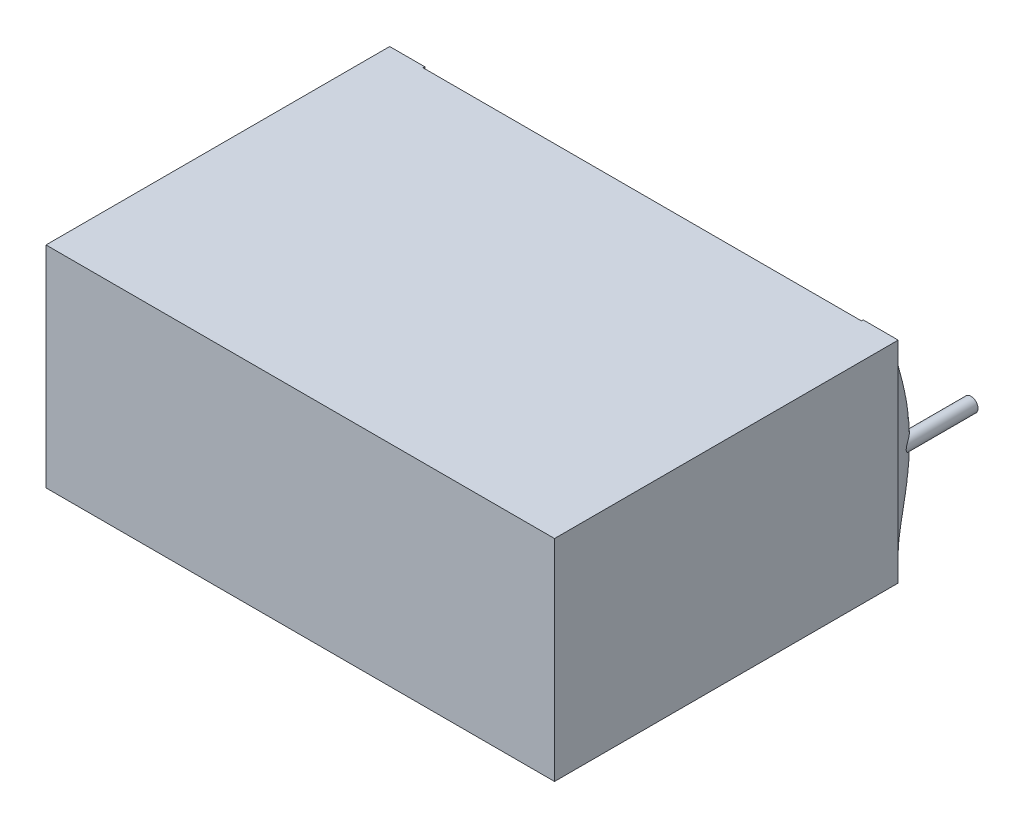
ISO-10303-21;
HEADER;
FILE_DESCRIPTION(('STEP AP214'),'2;1');
FILE_NAME('part.step','',(''),(''),'','','');
FILE_SCHEMA(('AUTOMOTIVE_DESIGN { 1 0 10303 214 1 1 1 1 }'));
ENDSEC;
DATA;
#1=APPLICATION_CONTEXT('core data for automotive mechanical design processes');
#2=APPLICATION_PROTOCOL_DEFINITION('international standard','automotive_design',2000,#1);
#3=PRODUCT_CONTEXT('',#1,'mechanical');
#4=PRODUCT('Part','Part','',(#3));
#5=PRODUCT_RELATED_PRODUCT_CATEGORY('part','',(#4));
#6=PRODUCT_DEFINITION_FORMATION('','',#4);
#7=PRODUCT_DEFINITION_CONTEXT('part definition',#1,'design');
#8=PRODUCT_DEFINITION('design','',#6,#7);
#9=PRODUCT_DEFINITION_SHAPE('','',#8);
#10=(LENGTH_UNIT() NAMED_UNIT(*) SI_UNIT(.MILLI.,.METRE.));
#11=(NAMED_UNIT(*) PLANE_ANGLE_UNIT() SI_UNIT($,.RADIAN.));
#12=(NAMED_UNIT(*) SI_UNIT($,.STERADIAN.) SOLID_ANGLE_UNIT());
#13=UNCERTAINTY_MEASURE_WITH_UNIT(LENGTH_MEASURE(1.E-05),#10,'distance_accuracy_value','');
#14=(GEOMETRIC_REPRESENTATION_CONTEXT(3) GLOBAL_UNCERTAINTY_ASSIGNED_CONTEXT((#13)) GLOBAL_UNIT_ASSIGNED_CONTEXT((#10,
#11,#12)) REPRESENTATION_CONTEXT('',''));
#15=CARTESIAN_POINT('',(0.,0.,0.));
#16=DIRECTION('',(0.,0.,1.));
#17=DIRECTION('',(1.,0.,0.));
#18=AXIS2_PLACEMENT_3D('',#15,#16,#17);
#19=CARTESIAN_POINT('',(36.8674969975976,-6.,2.));
#20=DIRECTION('',(0.,0.,1.));
#21=DIRECTION('',(1.,0.,0.));
#22=AXIS2_PLACEMENT_3D('',#19,#20,#21);
#23=PLANE('',#22);
#24=DIRECTION('',(0.,-1.,0.));
#25=VECTOR('',#24,1.);
#26=CARTESIAN_POINT('',(9.8674969975976,-6.,2.));
#27=LINE('',#26,#25);
#28=CARTESIAN_POINT('',(9.8674969975976,6.,2.));
#29=VERTEX_POINT('',#28);
#30=CARTESIAN_POINT('',(9.8674969975976,-6.,2.));
#31=VERTEX_POINT('',#30);
#32=EDGE_CURVE('E432',#29,#31,#27,.T.);
#33=ORIENTED_EDGE('',*,*,#32,.F.);
#34=DIRECTION('',(-1.,0.,0.));
#35=VECTOR('',#34,1.);
#36=CARTESIAN_POINT('',(7.8674969975976,6.,2.));
#37=LINE('',#36,#35);
#38=CARTESIAN_POINT('',(34.8674969975976,6.,2.));
#39=VERTEX_POINT('',#38);
#40=EDGE_CURVE('E290',#39,#29,#37,.T.);
#41=ORIENTED_EDGE('',*,*,#40,.F.);
#42=DIRECTION('',(0.,1.,0.));
#43=VECTOR('',#42,1.);
#44=CARTESIAN_POINT('',(34.8674969975976,6.,2.));
#45=LINE('',#44,#43);
#46=CARTESIAN_POINT('',(34.8674969975976,-6.,2.));
#47=VERTEX_POINT('',#46);
#48=EDGE_CURVE('E351',#47,#39,#45,.T.);
#49=ORIENTED_EDGE('',*,*,#48,.F.);
#50=DIRECTION('',(1.,0.,0.));
#51=VECTOR('',#50,1.);
#52=CARTESIAN_POINT('',(36.8674969975976,-6.,2.));
#53=LINE('',#52,#51);
#54=EDGE_CURVE('E246',#31,#47,#53,.T.);
#55=ORIENTED_EDGE('',*,*,#54,.F.);
#56=EDGE_LOOP('',(#33,#41,#49,#55));
#57=FACE_BOUND('',#56,.T.);
#58=ADVANCED_FACE('F223',(#57),#23,.F.);
#59=CARTESIAN_POINT('',(36.8674969975976,-6.,21.5));
#60=DIRECTION('',(0.,1.,0.));
#61=DIRECTION('',(-1.,0.,0.));
#62=AXIS2_PLACEMENT_3D('',#59,#60,#61);
#63=PLANE('',#62);
#64=DIRECTION('',(0.,0.,-1.));
#65=VECTOR('',#64,1.);
#66=CARTESIAN_POINT('',(7.8674969975976,-6.,21.5));
#67=LINE('',#66,#65);
#68=CARTESIAN_POINT('',(7.8674969975976,-6.,21.5));
#69=VERTEX_POINT('',#68);
#70=CARTESIAN_POINT('',(7.86749699759759,-6.,1.90018719506918));
#71=VERTEX_POINT('',#70);
#72=EDGE_CURVE('E322',#69,#71,#67,.T.);
#73=ORIENTED_EDGE('',*,*,#72,.T.);
#74=CARTESIAN_POINT('',(9.86749699759759,-5.99999999999999,1.90018812940335));
#75=CARTESIAN_POINT('',(9.79835259962124,-6.,1.89989284296278));
#76=CARTESIAN_POINT('',(9.72920793500892,-6.,1.89972873036072));
#77=CARTESIAN_POINT('',(9.59091853304827,-6.,1.89956002418815));
#78=CARTESIAN_POINT('',(9.52177379570048,-6.,1.89955543024527));
#79=CARTESIAN_POINT('',(9.31433957411765,-6.,1.89962668340483));
#80=CARTESIAN_POINT('',(9.17605018735916,-6.00000000000001,1.8997875656342));
#81=CARTESIAN_POINT('',(8.94023870868776,-6.00000000000001,1.89991081176893));
#82=CARTESIAN_POINT('',(8.84271665765362,-6.,1.8999177168697));
#83=CARTESIAN_POINT('',(8.64767264918446,-6.,1.89984419422075));
#84=CARTESIAN_POINT('',(8.55015069174942,-6.,1.89976376648727));
#85=CARTESIAN_POINT('',(8.35510665607188,-6.,1.89960815940389));
#86=CARTESIAN_POINT('',(8.25758457782935,-6.,1.8995329800555));
#87=CARTESIAN_POINT('',(8.06254058180711,-6.,1.8996220103945));
#88=CARTESIAN_POINT('',(7.9650186640275,-6.,1.89978622019137));
#89=CARTESIAN_POINT('',(7.86749699759757,-6.,1.90018719506919));
#90=B_SPLINE_CURVE_WITH_KNOTS('',3,(#74,#75,#76,#77,#78,#79,#80,#81,#82,#83,#84,#85,#86,#87,#88,
#89),.UNSPECIFIED.,.F.,.F.,(4,2,2,2,2,2,2,4),(0.,0.207434556948013,0.414868629673564,
0.829737096172103,1.1223031718588,1.414869193166,1.7074352991832,2.00000153900381),.UNSPECIFIED.);
#91=CARTESIAN_POINT('',(9.86749699759759,-5.99999999999999,1.90018812940335));
#92=VERTEX_POINT('',#91);
#93=EDGE_CURVE('E283',#92,#71,#90,.T.);
#94=ORIENTED_EDGE('',*,*,#93,.F.);
#95=DIRECTION('',(0.,0.,1.));
#96=VECTOR('',#95,1.);
#97=CARTESIAN_POINT('',(9.8674969975976,-6.,1.9));
#98=LINE('',#97,#96);
#99=EDGE_CURVE('E277',#92,#31,#98,.T.);
#100=ORIENTED_EDGE('',*,*,#99,.T.);
#101=ORIENTED_EDGE('',*,*,#54,.T.);
#102=DIRECTION('',(0.,0.,1.));
#103=VECTOR('',#102,1.);
#104=CARTESIAN_POINT('',(34.8674969975976,-6.,1.9));
#105=LINE('',#104,#103);
#106=CARTESIAN_POINT('',(34.8674969975976,-6.,1.90018153614774));
#107=VERTEX_POINT('',#106);
#108=EDGE_CURVE('E337',#107,#47,#105,.T.);
#109=ORIENTED_EDGE('',*,*,#108,.F.);
#110=CARTESIAN_POINT('',(36.8674969975976,-6.00000000000001,1.90018724188292));
#111=CARTESIAN_POINT('',(36.798352598685,-6.,1.89989203534321));
#112=CARTESIAN_POINT('',(36.7292079336438,-6.,1.89972817813167));
#113=CARTESIAN_POINT('',(36.5909185307416,-6.,1.89956000573595));
#114=CARTESIAN_POINT('',(36.5217737928812,-6.,1.89955569018059));
#115=CARTESIAN_POINT('',(36.3143395708487,-6.,1.89962732102807));
#116=CARTESIAN_POINT('',(36.176050183999,-6.00000000000001,1.89978784508049));
#117=CARTESIAN_POINT('',(35.9402387064645,-6.00000000000001,1.89991050790632));
#118=CARTESIAN_POINT('',(35.8427166565192,-6.,1.89991717978203));
#119=CARTESIAN_POINT('',(35.6476726492115,-6.,1.89984372846159));
#120=CARTESIAN_POINT('',(35.5501506918491,-6.,1.89976360528126));
#121=CARTESIAN_POINT('',(35.3551066588487,-6.,1.89960890878508));
#122=CARTESIAN_POINT('',(35.2575845832106,-6.,1.89953433547078));
#123=CARTESIAN_POINT('',(35.062540588838,-6.,1.89962225594804));
#124=CARTESIAN_POINT('',(34.9650186701036,-5.99999999999999,1.89978474984599));
#125=CARTESIAN_POINT('',(34.8674969975976,-6.,1.90018153614774));
#126=B_SPLINE_CURVE_WITH_KNOTS('',3,(#110,#111,#112,#113,#114,#115,#116,#117,#118,#119,#120,
#121,#122,#123,#124,#125),.UNSPECIFIED.,.F.,.F.,(4,2,2,2,2,2,2,4),(0.,0.207434556936427,
0.414868631269337,0.829737097255718,1.12230317012146,1.41486918962224,1.7074352905595,
2.00000152277545),.UNSPECIFIED.);
#127=CARTESIAN_POINT('',(36.8674969975976,-5.99999999999999,1.90018724188292));
#128=VERTEX_POINT('',#127);
#129=EDGE_CURVE('E350',#128,#107,#126,.T.);
#130=ORIENTED_EDGE('',*,*,#129,.F.);
#131=DIRECTION('',(0.,0.,-1.));
#132=VECTOR('',#131,1.);
#133=CARTESIAN_POINT('',(36.8674969975976,-6.,21.5));
#134=LINE('',#133,#132);
#135=CARTESIAN_POINT('',(36.8674969975976,-6.,21.5));
#136=VERTEX_POINT('',#135);
#137=EDGE_CURVE('E341',#136,#128,#134,.T.);
#138=ORIENTED_EDGE('',*,*,#137,.F.);
#139=DIRECTION('',(1.,0.,0.));
#140=VECTOR('',#139,1.);
#141=CARTESIAN_POINT('',(36.8674969975976,-6.,21.5));
#142=LINE('',#141,#140);
#143=EDGE_CURVE('E439',#69,#136,#142,.T.);
#144=ORIENTED_EDGE('',*,*,#143,.F.);
#145=EDGE_LOOP('',(#73,#94,#100,#101,#109,#130,#138,#144));
#146=FACE_BOUND('',#145,.T.);
#147=ADVANCED_FACE('F367',(#146),#63,.F.);
#148=CARTESIAN_POINT('',(36.8674969975976,6.,21.5));
#149=DIRECTION('',(-1.,0.,0.));
#150=DIRECTION('',(0.,0.,1.));
#151=AXIS2_PLACEMENT_3D('',#148,#149,#150);
#152=PLANE('',#151);
#153=ORIENTED_EDGE('',*,*,#137,.T.);
#154=CARTESIAN_POINT('',(36.8674969975976,5.99999999999999,1.90018719506919));
#155=CARTESIAN_POINT('',(36.8674969975977,5.86171168250951,1.90014004041916));
#156=CARTESIAN_POINT('',(36.8674969975976,5.72342336298642,1.90009932998568));
#157=CARTESIAN_POINT('',(36.8674969975976,5.44684672114222,1.90002896482786));
#158=CARTESIAN_POINT('',(36.8674969975975,5.3085583988211,1.89999931010352));
#159=CARTESIAN_POINT('',(36.8674969975975,5.03198175260018,1.89994922364002));
#160=CARTESIAN_POINT('',(36.8674969975976,4.89369342870038,1.89992879190086));
#161=CARTESIAN_POINT('',(36.8674969975977,4.47882845548978,1.89987879635969));
#162=CARTESIAN_POINT('',(36.8674969975975,4.20225180484181,1.89986053223399));
#163=CARTESIAN_POINT('',(36.8674969975975,3.64909850348765,1.89984237431071));
#164=CARTESIAN_POINT('',(36.8674969975975,3.37252185278144,1.8998424805131));
#165=CARTESIAN_POINT('',(36.8674969975976,2.95765687692437,1.89984938585406));
#166=CARTESIAN_POINT('',(36.8674969975976,2.81936855169693,1.89985281197394));
#167=CARTESIAN_POINT('',(36.8674969975976,2.4045035760859,1.89986505783325));
#168=CARTESIAN_POINT('',(36.8674969975976,2.12792692577084,1.89987584507232));
#169=CARTESIAN_POINT('',(36.8674969975976,1.29819697464354,1.89990608819711));
#170=CARTESIAN_POINT('',(36.8674969975976,0.74504367368343,1.89992342549037));
#171=CARTESIAN_POINT('',(36.8674969975976,-0.361262928550195,1.89992934925927));
#172=CARTESIAN_POINT('',(36.8674969975976,-0.914416229823708,1.89991793573491));
#173=CARTESIAN_POINT('',(36.8674969975976,-1.60585785591304,1.899894944135));
#174=CARTESIAN_POINT('',(36.8674969975976,-1.74414618108196,1.89988990958029));
#175=CARTESIAN_POINT('',(36.8674969975976,-2.1590111565852,1.89987454095472));
#176=CARTESIAN_POINT('',(36.8674969975976,-2.4355878069159,1.8998639419224));
#177=CARTESIAN_POINT('',(36.8674969975976,-2.98874110777997,1.8998480392004));
#178=CARTESIAN_POINT('',(36.8674969975976,-3.26531775831334,1.89984273551073));
#179=CARTESIAN_POINT('',(36.8674969975976,-3.81847105963628,1.89984587573069));
#180=CARTESIAN_POINT('',(36.8674969975976,-4.09504771042584,1.89985431964033));
#181=CARTESIAN_POINT('',(36.8674969975976,-4.50991268527252,1.8998853174187));
#182=CARTESIAN_POINT('',(36.8674969975977,-4.64820100998463,1.89989870533047));
#183=CARTESIAN_POINT('',(36.8674969975977,-4.92477765849985,1.89993316500749));
#184=CARTESIAN_POINT('',(36.8674969975976,-5.06306598230296,1.89995423677274));
#185=CARTESIAN_POINT('',(36.8674969975976,-5.33446192297882,1.90000476548834));
#186=CARTESIAN_POINT('',(36.8674969975976,-5.46756953991362,1.90003387873007));
#187=CARTESIAN_POINT('',(36.8674969975976,-5.73378477186355,1.90010241554949));
#188=CARTESIAN_POINT('',(36.8674969975976,-5.86689238687869,1.90014183912723));
#189=CARTESIAN_POINT('',(36.8674969975976,-6.,1.90018724188292));
#190=B_SPLINE_CURVE_WITH_KNOTS('',3,(#154,#155,#156,#157,#158,#159,#160,#161,#162,#163,#164,
#165,#166,#167,#168,#169,#170,#171,#172,#173,#174,#175,#176,#177,#178,#179,#180,#181,#182,#183,
#184,#185,#186,#187,#188,#189),.UNSPECIFIED.,.F.,.F.,(4,2,2,2,2,2,2,2,2,2,2,2,2,2,2,2,2,4),(0.,
0.414864976203014,0.829729952288654,1.24459492828302,2.0743248807939,2.90405483269042,
3.31891980849137,4.14864976008514,5.80810966337549,7.46756956692262,7.88243454271412,
8.71216449429745,9.54189444596856,10.3716243979557,10.7864893738662,11.2013543498408,
11.6006772098218,12.0000000720707),.UNSPECIFIED.);
#191=CARTESIAN_POINT('',(36.8674969975976,6.,1.90018719506919));
#192=VERTEX_POINT('',#191);
#193=EDGE_CURVE('E343',#192,#128,#190,.T.);
#194=ORIENTED_EDGE('',*,*,#193,.F.);
#195=DIRECTION('',(0.,0.,-1.));
#196=VECTOR('',#195,1.);
#197=CARTESIAN_POINT('',(36.8674969975976,6.,21.5));
#198=LINE('',#197,#196);
#199=CARTESIAN_POINT('',(36.8674969975976,6.,21.5));
#200=VERTEX_POINT('',#199);
#201=EDGE_CURVE('E321',#200,#192,#198,.T.);
#202=ORIENTED_EDGE('',*,*,#201,.F.);
#203=DIRECTION('',(0.,1.,0.));
#204=VECTOR('',#203,1.);
#205=CARTESIAN_POINT('',(36.8674969975976,6.,21.5));
#206=LINE('',#205,#204);
#207=EDGE_CURVE('E309',#136,#200,#206,.T.);
#208=ORIENTED_EDGE('',*,*,#207,.F.);
#209=EDGE_LOOP('',(#153,#194,#202,#208));
#210=FACE_BOUND('',#209,.T.);
#211=ADVANCED_FACE('F357',(#210),#152,.F.);
#212=CARTESIAN_POINT('',(7.8674969975976,6.,21.5));
#213=DIRECTION('',(0.,-1.,0.));
#214=DIRECTION('',(1.,0.,0.));
#215=AXIS2_PLACEMENT_3D('',#212,#213,#214);
#216=PLANE('',#215);
#217=ORIENTED_EDGE('',*,*,#201,.T.);
#218=CARTESIAN_POINT('',(34.8674969975976,6.,1.90018812940335));
#219=CARTESIAN_POINT('',(34.936641395574,6.,1.89989284296278));
#220=CARTESIAN_POINT('',(35.0057860601863,6.,1.89972873036072));
#221=CARTESIAN_POINT('',(35.1440754621469,6.,1.89956002418815));
#222=CARTESIAN_POINT('',(35.2132201994947,6.,1.89955543024527));
#223=CARTESIAN_POINT('',(35.4206544210775,6.,1.89962668340483));
#224=CARTESIAN_POINT('',(35.558943807836,6.,1.8997875656342));
#225=CARTESIAN_POINT('',(35.7947552865074,6.,1.89991081176893));
#226=CARTESIAN_POINT('',(35.8922773375415,6.,1.8999177168697));
#227=CARTESIAN_POINT('',(36.0873213460106,6.,1.89984419422076));
#228=CARTESIAN_POINT('',(36.1848433034457,6.,1.89976376648727));
#229=CARTESIAN_POINT('',(36.3798873391232,6.,1.89960815940389));
#230=CARTESIAN_POINT('',(36.4774094173658,6.,1.8995329800555));
#231=CARTESIAN_POINT('',(36.672453413388,6.,1.8996220103945));
#232=CARTESIAN_POINT('',(36.7699753311676,6.,1.89978622019137));
#233=CARTESIAN_POINT('',(36.8674969975975,6.,1.90018719506919));
#234=B_SPLINE_CURVE_WITH_KNOTS('',3,(#218,#219,#220,#221,#222,#223,#224,#225,#226,#227,#228,
#229,#230,#231,#232,#233),.UNSPECIFIED.,.F.,.F.,(4,2,2,2,2,2,2,4),(0.,0.207434556947992,
0.414868629673516,0.829737096172013,1.1223031718587,1.4148691931659,1.70743529918309,
2.0000015390037),.UNSPECIFIED.);
#235=CARTESIAN_POINT('',(34.8674969975976,6.,1.90018812940335));
#236=VERTEX_POINT('',#235);
#237=EDGE_CURVE('E384',#236,#192,#234,.T.);
#238=ORIENTED_EDGE('',*,*,#237,.F.);
#239=DIRECTION('',(0.,0.,1.));
#240=VECTOR('',#239,1.);
#241=CARTESIAN_POINT('',(34.8674969975976,6.,1.9));
#242=LINE('',#241,#240);
#243=EDGE_CURVE('E388',#236,#39,#242,.T.);
#244=ORIENTED_EDGE('',*,*,#243,.T.);
#245=ORIENTED_EDGE('',*,*,#40,.T.);
#246=DIRECTION('',(0.,0.,1.));
#247=VECTOR('',#246,1.);
#248=CARTESIAN_POINT('',(9.8674969975976,6.,1.9));
#249=LINE('',#248,#247);
#250=CARTESIAN_POINT('',(9.86749699759759,6.,1.90018153614774));
#251=VERTEX_POINT('',#250);
#252=EDGE_CURVE('E437',#251,#29,#249,.T.);
#253=ORIENTED_EDGE('',*,*,#252,.F.);
#254=CARTESIAN_POINT('',(7.86749699759758,6.,1.90018724188293));
#255=CARTESIAN_POINT('',(7.93664139651015,6.,1.89989203534321));
#256=CARTESIAN_POINT('',(8.00578606155138,6.,1.89972817813168));
#257=CARTESIAN_POINT('',(8.14407546445358,6.,1.89956000573595));
#258=CARTESIAN_POINT('',(8.21322020231401,6.,1.89955569018059));
#259=CARTESIAN_POINT('',(8.42065442434658,6.,1.89962732102807));
#260=CARTESIAN_POINT('',(8.55894381119626,6.,1.89978784508049));
#261=CARTESIAN_POINT('',(8.79475528873079,6.,1.89991050790632));
#262=CARTESIAN_POINT('',(8.89227733867614,6.,1.89991717978204));
#263=CARTESIAN_POINT('',(9.08732134598382,6.,1.89984372846159));
#264=CARTESIAN_POINT('',(9.18484330334616,6.,1.89976360528126));
#265=CARTESIAN_POINT('',(9.37988733634655,6.,1.89960890878508));
#266=CARTESIAN_POINT('',(9.47740941198462,6.,1.89953433547078));
#267=CARTESIAN_POINT('',(9.67245340635721,6.,1.89962225594805));
#268=CARTESIAN_POINT('',(9.76997532509165,6.,1.89978474984599));
#269=CARTESIAN_POINT('',(9.86749699759759,5.99999999999999,1.90018153614774));
#270=B_SPLINE_CURVE_WITH_KNOTS('',3,(#254,#255,#256,#257,#258,#259,#260,#261,#262,#263,#264,
#265,#266,#267,#268,#269),.UNSPECIFIED.,.F.,.F.,(4,2,2,2,2,2,2,4),(0.,0.20743455693645,
0.414868631269396,0.829737097255842,1.12230317012157,1.41486918962232,1.70743529055955,
2.00000152277546),.UNSPECIFIED.);
#271=CARTESIAN_POINT('',(7.86749699759759,6.,1.90018724188293));
#272=VERTEX_POINT('',#271);
#273=EDGE_CURVE('E318',#272,#251,#270,.T.);
#274=ORIENTED_EDGE('',*,*,#273,.F.);
#275=DIRECTION('',(0.,0.,-1.));
#276=VECTOR('',#275,1.);
#277=CARTESIAN_POINT('',(7.8674969975976,6.,21.5));
#278=LINE('',#277,#276);
#279=CARTESIAN_POINT('',(7.8674969975976,6.,21.5));
#280=VERTEX_POINT('',#279);
#281=EDGE_CURVE('E315',#280,#272,#278,.T.);
#282=ORIENTED_EDGE('',*,*,#281,.F.);
#283=DIRECTION('',(-1.,0.,0.));
#284=VECTOR('',#283,1.);
#285=CARTESIAN_POINT('',(7.8674969975976,6.,21.5));
#286=LINE('',#285,#284);
#287=EDGE_CURVE('E302',#200,#280,#286,.T.);
#288=ORIENTED_EDGE('',*,*,#287,.F.);
#289=EDGE_LOOP('',(#217,#238,#244,#245,#253,#274,#282,#288));
#290=FACE_BOUND('',#289,.T.);
#291=ADVANCED_FACE('F316',(#290),#216,.F.);
#292=CARTESIAN_POINT('',(7.8674969975976,-6.,21.5));
#293=DIRECTION('',(1.,0.,0.));
#294=DIRECTION('',(0.,1.,0.));
#295=AXIS2_PLACEMENT_3D('',#292,#293,#294);
#296=PLANE('',#295);
#297=ORIENTED_EDGE('',*,*,#281,.T.);
#298=CARTESIAN_POINT('',(7.86749699759759,-6.,1.90018719506918));
#299=CARTESIAN_POINT('',(7.86749699759761,-5.86171168250949,1.90014004041913));
#300=CARTESIAN_POINT('',(7.86749699759762,-5.72342336298639,1.90009932998565));
#301=CARTESIAN_POINT('',(7.86749699759761,-5.44684672114215,1.90002896482783));
#302=CARTESIAN_POINT('',(7.8674969975976,-5.30855839882102,1.89999931010349));
#303=CARTESIAN_POINT('',(7.86749699759759,-5.03198175260007,1.89994922363998));
#304=CARTESIAN_POINT('',(7.8674969975976,-4.89369342870025,1.8999287919008));
#305=CARTESIAN_POINT('',(7.86749699759761,-4.4788284554896,1.89987879635959));
#306=CARTESIAN_POINT('',(7.86749699759762,-4.20225180484161,1.89986053223391));
#307=CARTESIAN_POINT('',(7.8674969975976,-3.64909850348737,1.89984237431065));
#308=CARTESIAN_POINT('',(7.86749699759758,-3.37252185278113,1.89984248051307));
#309=CARTESIAN_POINT('',(7.86749699759759,-2.957656876924,1.89984938585399));
#310=CARTESIAN_POINT('',(7.8674969975976,-2.81936855169655,1.89985281197385));
#311=CARTESIAN_POINT('',(7.86749699759761,-2.40450357608547,1.89986505783311));
#312=CARTESIAN_POINT('',(7.86749699759759,-2.12792692577038,1.89987584507221));
#313=CARTESIAN_POINT('',(7.86749699759756,-1.29819697464298,1.89990608819704));
#314=CARTESIAN_POINT('',(7.86749699759759,-0.745043673682798,1.89992342549028));
#315=CARTESIAN_POINT('',(7.86749699759762,0.361262928550963,1.89992934925916));
#316=CARTESIAN_POINT('',(7.86749699759761,0.914416229824544,1.89991793573481));
#317=CARTESIAN_POINT('',(7.8674969975976,1.60585785591396,1.89989494413492));
#318=CARTESIAN_POINT('',(7.8674969975976,1.7441461810829,1.89988990958022));
#319=CARTESIAN_POINT('',(7.86749699759759,2.15901115658619,1.89987454095466));
#320=CARTESIAN_POINT('',(7.86749699759759,2.43558780691692,1.89986394192233));
#321=CARTESIAN_POINT('',(7.8674969975976,2.98874110778106,1.89984803920033));
#322=CARTESIAN_POINT('',(7.8674969975976,3.26531775831447,1.89984273551066));
#323=CARTESIAN_POINT('',(7.86749699759759,3.81847105963747,1.89984587573065));
#324=CARTESIAN_POINT('',(7.86749699759758,4.09504771042707,1.89985431964031));
#325=CARTESIAN_POINT('',(7.86749699759758,4.5099126852738,1.89988531741865));
#326=CARTESIAN_POINT('',(7.86749699759758,4.64820100998593,1.8998987053304));
#327=CARTESIAN_POINT('',(7.86749699759759,4.92477765850118,1.89993316500743));
#328=CARTESIAN_POINT('',(7.8674969975976,5.0630659823043,1.8999542367727));
#329=CARTESIAN_POINT('',(7.86749699759761,5.33446192297995,1.90000476548833));
#330=CARTESIAN_POINT('',(7.8674969975976,5.46756953991452,1.90003387873006));
#331=CARTESIAN_POINT('',(7.8674969975976,5.733784771864,1.90010241554947));
#332=CARTESIAN_POINT('',(7.8674969975976,5.86689238687891,1.90014183912721));
#333=CARTESIAN_POINT('',(7.86749699759761,5.99999999999999,1.90018724188293));
#334=B_SPLINE_CURVE_WITH_KNOTS('',3,(#298,#299,#300,#301,#302,#303,#304,#305,#306,#307,#308,
#309,#310,#311,#312,#313,#314,#315,#316,#317,#318,#319,#320,#321,#322,#323,#324,#325,#326,#327,
#328,#329,#330,#331,#332,#333),.UNSPECIFIED.,.F.,.F.,(4,2,2,2,2,2,2,2,2,2,2,2,2,2,2,2,2,4),(0.,
0.414864976203069,0.829729952288751,1.24459492828317,2.07432488079415,2.90405483269077,
3.31891980849177,4.14864976008564,5.8081096633762,7.46756956692353,7.88243454271508,
8.71216449429851,9.54189444596973,10.3716243979569,10.7864893738675,11.2013543498422,
11.6006772098224,12.0000000720707),.UNSPECIFIED.);
#335=EDGE_CURVE('E402',#71,#272,#334,.T.);
#336=ORIENTED_EDGE('',*,*,#335,.F.);
#337=ORIENTED_EDGE('',*,*,#72,.F.);
#338=DIRECTION('',(0.,-1.,0.));
#339=VECTOR('',#338,1.);
#340=CARTESIAN_POINT('',(7.8674969975976,-6.,21.5));
#341=LINE('',#340,#339);
#342=EDGE_CURVE('E307',#280,#69,#341,.T.);
#343=ORIENTED_EDGE('',*,*,#342,.F.);
#344=EDGE_LOOP('',(#297,#336,#337,#343));
#345=FACE_BOUND('',#344,.T.);
#346=ADVANCED_FACE('F324',(#345),#296,.F.);
#347=CARTESIAN_POINT('',(36.8674969975976,-6.,21.5));
#348=DIRECTION('',(0.,0.,1.));
#349=DIRECTION('',(1.,0.,0.));
#350=AXIS2_PLACEMENT_3D('',#347,#348,#349);
#351=PLANE('',#350);
#352=ORIENTED_EDGE('',*,*,#143,.T.);
#353=ORIENTED_EDGE('',*,*,#207,.T.);
#354=ORIENTED_EDGE('',*,*,#287,.T.);
#355=ORIENTED_EDGE('',*,*,#342,.T.);
#356=EDGE_LOOP('',(#352,#353,#354,#355));
#357=FACE_BOUND('',#356,.T.);
#358=ADVANCED_FACE('F305',(#357),#351,.T.);
#359=CARTESIAN_POINT('',(34.8674969975976,6.,1.9));
#360=DIRECTION('',(1.,0.,0.));
#361=DIRECTION('',(0.,0.,-1.));
#362=AXIS2_PLACEMENT_3D('',#359,#360,#361);
#363=PLANE('',#362);
#364=ORIENTED_EDGE('',*,*,#48,.T.);
#365=ORIENTED_EDGE('',*,*,#243,.F.);
#366=CARTESIAN_POINT('',(34.8674969975976,-5.99999999999999,1.90018153614774));
#367=CARTESIAN_POINT('',(34.8674969975976,-5.72342336172654,1.90008827355736));
#368=CARTESIAN_POINT('',(34.8674969975976,-5.44684671886289,1.90001909364852));
#369=CARTESIAN_POINT('',(34.8674969975977,-4.41450112584046,1.89982945765137));
#370=CARTESIAN_POINT('',(34.8674969975976,-3.65873215521703,1.89982782881856));
#371=CARTESIAN_POINT('',(34.8674969975975,-2.05108116261527,1.89986845503539));
#372=CARTESIAN_POINT('',(34.8674969975976,-1.19919914211445,1.8999163172529));
#373=CARTESIAN_POINT('',(34.8674969975976,0.504564900162015,1.89993387123372));
#374=CARTESIAN_POINT('',(34.8674969975977,1.35644692193767,1.89990356299728));
#375=CARTESIAN_POINT('',(34.8674969975976,2.54518600563198,1.89985988845201));
#376=CARTESIAN_POINT('',(34.8674969975976,2.88204306797456,1.89984735743166));
#377=CARTESIAN_POINT('',(34.8674969975974,4.14593342577903,1.89983255764675));
#378=CARTESIAN_POINT('',(34.8674969975974,5.07296671834024,1.8998867327994));
#379=CARTESIAN_POINT('',(34.8674969975977,5.99999999999999,1.90018812940335));
#380=B_SPLINE_CURVE_WITH_KNOTS('',3,(#366,#367,#368,#369,#370,#371,#372,#373,#374,#375,#376,
#377,#378,#379),.UNSPECIFIED.,.F.,.F.,(4,2,2,2,2,2,4),(0.,0.829729954568542,3.09703684059596,
5.65268291225586,8.20832897560359,9.21890016268049,12.0000000541683),.UNSPECIFIED.);
#381=EDGE_CURVE('E378',#107,#236,#380,.T.);
#382=ORIENTED_EDGE('',*,*,#381,.F.);
#383=ORIENTED_EDGE('',*,*,#108,.T.);
#384=EDGE_LOOP('',(#364,#365,#382,#383));
#385=FACE_BOUND('',#384,.T.);
#386=ADVANCED_FACE('F418',(#385),#363,.F.);
#387=CARTESIAN_POINT('',(9.8674969975976,-6.,1.9));
#388=DIRECTION('',(-1.,0.,0.));
#389=DIRECTION('',(0.,0.,1.));
#390=AXIS2_PLACEMENT_3D('',#387,#388,#389);
#391=PLANE('',#390);
#392=ORIENTED_EDGE('',*,*,#32,.T.);
#393=ORIENTED_EDGE('',*,*,#99,.F.);
#394=CARTESIAN_POINT('',(9.86749699759759,6.,1.90018153614774));
#395=CARTESIAN_POINT('',(9.8674969975976,5.72342336172651,1.90008827355737));
#396=CARTESIAN_POINT('',(9.86749699759761,5.44684671886284,1.90001909364854));
#397=CARTESIAN_POINT('',(9.86749699759761,4.41450112583969,1.89982945765139));
#398=CARTESIAN_POINT('',(9.8674969975976,3.65873215521556,1.89982782881857));
#399=CARTESIAN_POINT('',(9.86749699759758,2.05108116261203,1.8998684550354));
#400=CARTESIAN_POINT('',(9.86749699759759,1.19919914211012,1.89991631725292));
#401=CARTESIAN_POINT('',(9.8674969975976,-0.504564900168521,1.89993387123375));
#402=CARTESIAN_POINT('',(9.8674969975976,-1.35644692194526,1.89990356299733));
#403=CARTESIAN_POINT('',(9.86749699759758,-2.54518600563747,1.89985988845202));
#404=CARTESIAN_POINT('',(9.86749699759758,-2.88204306797685,1.89984735743166));
#405=CARTESIAN_POINT('',(9.86749699759756,-4.14593342577842,1.89983255764669));
#406=CARTESIAN_POINT('',(9.86749699759755,-5.07296671833993,1.89988673279931));
#407=CARTESIAN_POINT('',(9.8674969975976,-6.,1.90018812940335));
#408=B_SPLINE_CURVE_WITH_KNOTS('',3,(#394,#395,#396,#397,#398,#399,#400,#401,#402,#403,#404,
#405,#406,#407),.UNSPECIFIED.,.F.,.F.,(4,2,2,2,2,2,4),(0.,0.829729954568639,3.09703684059812,
5.65268291226128,8.20832897561228,9.21890016267958,12.0000000541684),.UNSPECIFIED.);
#409=EDGE_CURVE('E401',#251,#92,#408,.T.);
#410=ORIENTED_EDGE('',*,*,#409,.F.);
#411=ORIENTED_EDGE('',*,*,#252,.T.);
#412=EDGE_LOOP('',(#392,#393,#410,#411));
#413=FACE_BOUND('',#412,.T.);
#414=ADVANCED_FACE('F365',(#413),#391,.F.);
#415=CARTESIAN_POINT('',(34.8474969975966,-6.12000000000612,1.89858349901551));
#416=CARTESIAN_POINT('',(35.255496997597,-6.12000000000612,1.93208518895256));
#417=CARTESIAN_POINT('',(35.6634969975974,-6.12000000000612,1.96430752583005));
#418=CARTESIAN_POINT('',(36.0714969975978,-6.12000000000612,1.9643398952168));
#419=CARTESIAN_POINT('',(36.4794969975982,-6.12000000000612,1.93206545854475));
#420=CARTESIAN_POINT('',(36.8874969975986,-6.12000000000612,1.89859035754045));
#421=CARTESIAN_POINT('',(34.8474969975966,-3.67200000000367,1.93308003630437));
#422=CARTESIAN_POINT('',(35.255496997597,-3.67200000000367,1.24206837909595));
#423=CARTESIAN_POINT('',(35.6634969975974,-3.67200000000367,0.663257139987945));
#424=CARTESIAN_POINT('',(36.0714969975978,-3.67200000000367,0.663251311075247));
#425=CARTESIAN_POINT('',(36.4794969975982,-3.67200000000367,1.24206334146399));
#426=CARTESIAN_POINT('',(36.8874969975986,-3.67200000000367,1.93308792579913));
#427=CARTESIAN_POINT('',(34.8474969975966,-1.22400000000122,1.96386817711876));
#428=CARTESIAN_POINT('',(35.255496997597,-1.22400000000122,0.662988335059473));
#429=CARTESIAN_POINT('',(35.6634969975974,-1.22400000000122,-0.55321972871588));
#430=CARTESIAN_POINT('',(36.0714969975978,-1.22400000000122,-0.553238584806453));
#431=CARTESIAN_POINT('',(36.4794969975982,-1.22400000000122,0.662983366871233));
#432=CARTESIAN_POINT('',(36.8874969975986,-1.22400000000122,1.96387410628619));
#433=CARTESIAN_POINT('',(34.8474969975966,1.22400000000122,1.9638923868412));
#434=CARTESIAN_POINT('',(35.255496997597,1.22400000000122,0.662987860416931));
#435=CARTESIAN_POINT('',(35.6634969975974,1.22400000000122,-0.553241239015341));
#436=CARTESIAN_POINT('',(36.0714969975978,1.22400000000122,-0.553226007232598));
#437=CARTESIAN_POINT('',(36.4794969975982,1.22400000000122,0.662981691832282));
#438=CARTESIAN_POINT('',(36.8874969975986,1.22400000000122,1.96387392361371));
#439=CARTESIAN_POINT('',(34.8474969975966,3.67200000000367,1.93307180281479));
#440=CARTESIAN_POINT('',(35.255496997597,3.67200000000367,1.24205700990222));
#441=CARTESIAN_POINT('',(35.6634969975974,3.67200000000367,0.663254300603338));
#442=CARTESIAN_POINT('',(36.0714969975978,3.67200000000367,0.66325071108804));
#443=CARTESIAN_POINT('',(36.4794969975982,3.67200000000367,1.2420638054362));
#444=CARTESIAN_POINT('',(36.8874969975986,3.67200000000367,1.93308805437466));
#445=CARTESIAN_POINT('',(34.8474969975966,6.12000000000612,1.89859206274944));
#446=CARTESIAN_POINT('',(35.255496997597,6.12000000000612,1.93206705606441));
#447=CARTESIAN_POINT('',(35.6634969975974,6.12000000000612,1.96433011023375));
#448=CARTESIAN_POINT('',(36.0714969975978,6.12000000000612,1.96432529994327));
#449=CARTESIAN_POINT('',(36.4794969975982,6.12000000000612,1.93206986029053));
#450=CARTESIAN_POINT('',(36.8874969975986,6.12000000000612,1.89859009483512));
#451=B_SPLINE_SURFACE_WITH_KNOTS('',5,5,((#415,#416,#417,#418,#419,#420),(#421,#422,#423,#424,
#425,#426),(#427,#428,#429,#430,#431,#432),(#433,#434,#435,#436,#437,#438),(#439,#440,#441,#442,
#443,#444),(#445,#446,#447,#448,#449,#450)),.UNSPECIFIED.,.F.,.F.,.F.,(6,6),(6,6),
(-6.12000000000612,6.12000000000612),(-1.02000000000102,1.02000000000103),.UNSPECIFIED.);
#452=CARTESIAN_POINT('',(36.5174969975976,0.,1.09400112783437));
#453=CARTESIAN_POINT('',(36.5174975495587,-0.0111226466484689,1.09400230976677));
#454=CARTESIAN_POINT('',(36.5170283812794,-0.0222416753949549,1.09307352569158));
#455=CARTESIAN_POINT('',(36.5152081287839,-0.0441237792483627,1.08947880165986));
#456=CARTESIAN_POINT('',(36.5138559660475,-0.0548864021150391,1.08681073729266));
#457=CARTESIAN_POINT('',(36.5077711142613,-0.0916183779458857,1.07485106962257));
#458=CARTESIAN_POINT('',(36.5010186823027,-0.115966249483956,1.06164501778336));
#459=CARTESIAN_POINT('',(36.4862216080186,-0.156314294129097,1.0332234966219));
#460=CARTESIAN_POINT('',(36.4785697510632,-0.173028550892164,1.0186914047356));
#461=CARTESIAN_POINT('',(36.4619987821935,-0.204018590755178,0.98776884205482));
#462=CARTESIAN_POINT('',(36.4530760129308,-0.21828706492372,0.97137303648766));
#463=CARTESIAN_POINT('',(36.434411941933,-0.244586192464716,0.937778215804483));
#464=CARTESIAN_POINT('',(36.4246835837485,-0.256644921306716,0.920593346736049));
#465=CARTESIAN_POINT('',(36.4044151260633,-0.27911583311907,0.885626172960228));
#466=CARTESIAN_POINT('',(36.3938744110727,-0.289526749004558,0.867843421127453));
#467=CARTESIAN_POINT('',(36.3610552472135,-0.318657771402036,0.813963780293103));
#468=CARTESIAN_POINT('',(36.337614866726,-0.335229217228805,0.777400264482585));
#469=CARTESIAN_POINT('',(36.289354492403,-0.362166594569614,0.70760258331969));
#470=CARTESIAN_POINT('',(36.2647983565129,-0.372925299352581,0.674337793126694));
#471=CARTESIAN_POINT('',(36.2252755996753,-0.385449436569741,0.625791606556048));
#472=CARTESIAN_POINT('',(36.2116845393903,-0.389018104648481,0.609866688493386));
#473=CARTESIAN_POINT('',(36.1834712940795,-0.394785561364376,0.578705211314851));
#474=CARTESIAN_POINT('',(36.1688483365836,-0.39698331137016,0.563469182198821));
#475=CARTESIAN_POINT('',(36.1241502232045,-0.401040499957022,0.520243146894582));
#476=CARTESIAN_POINT('',(36.0923386160393,-0.400689491708182,0.49355192845741));
#477=CARTESIAN_POINT('',(36.0439331995732,-0.393445282992439,0.461532203805694));
#478=CARTESIAN_POINT('',(36.029067658682,-0.390417114168388,0.452727838895555));
#479=CARTESIAN_POINT('',(35.9988335005137,-0.382313471294439,0.437151079098929));
#480=CARTESIAN_POINT('',(35.9834656672691,-0.377241059882851,0.430375670826699));
#481=CARTESIAN_POINT('',(35.9526287570857,-0.364822985586743,0.419188694497296));
#482=CARTESIAN_POINT('',(35.937159751411,-0.357461153429222,0.414794569848489));
#483=CARTESIAN_POINT('',(35.9069334682948,-0.340533534013194,0.408495799487976));
#484=CARTESIAN_POINT('',(35.8921765271588,-0.330966717434614,0.406592319226357));
#485=CARTESIAN_POINT('',(35.8654906015647,-0.311031976080109,0.404986663096227));
#486=CARTESIAN_POINT('',(35.8534276051506,-0.300855914976727,0.405072884049732));
#487=CARTESIAN_POINT('',(35.8306257453916,-0.279199605015091,0.406485097421672));
#488=CARTESIAN_POINT('',(35.8198874123245,-0.267718837378731,0.407811584521242));
#489=CARTESIAN_POINT('',(35.7980520555046,-0.241449030730034,0.411539151055377));
#490=CARTESIAN_POINT('',(35.7872480457229,-0.226438817487763,0.41409229931578));
#491=CARTESIAN_POINT('',(35.7678264071866,-0.195117129942436,0.419533293420875));
#492=CARTESIAN_POINT('',(35.7592104411671,-0.178804678342713,0.422421391386858));
#493=CARTESIAN_POINT('',(35.7426852238901,-0.141479902879298,0.428487892511462));
#494=CARTESIAN_POINT('',(35.7353229975405,-0.12020948120777,0.431595896887062));
#495=CARTESIAN_POINT('',(35.7242566868722,-0.0765966372504536,0.436476734254867));
#496=CARTESIAN_POINT('',(35.7205493963656,-0.0542551725826799,0.438250737136966));
#497=CARTESIAN_POINT('',(35.717041489779,-0.0101593843913875,0.439928402723367));
#498=CARTESIAN_POINT('',(35.7170801901941,0.0115790433274672,0.439908995089845));
#499=CARTESIAN_POINT('',(35.7206635468013,0.0546933175853307,0.438197037142598));
#500=CARTESIAN_POINT('',(35.724208371004,0.0760691466989702,0.436504406649348));
#501=CARTESIAN_POINT('',(35.7343660878376,0.116736189300215,0.432012253415422));
#502=CARTESIAN_POINT('',(35.7408082973813,0.136077935409973,0.429275447740247));
#503=CARTESIAN_POINT('',(35.7565242225224,0.173527538245027,0.42334140449353));
#504=CARTESIAN_POINT('',(35.7658023590712,0.191633414064222,0.420143452177519));
#505=CARTESIAN_POINT('',(35.7881570750272,0.228124438938198,0.413794076197284));
#506=CARTESIAN_POINT('',(35.8015322509921,0.246335343285073,0.410683600224499));
#507=CARTESIAN_POINT('',(35.8312919254176,0.280344378800982,0.406269264612552));
#508=CARTESIAN_POINT('',(35.8476676348358,0.29614931612363,0.404960221195466));
#509=CARTESIAN_POINT('',(35.8776620946022,0.320524129828155,0.405458635597079));
#510=CARTESIAN_POINT('',(35.8906748969094,0.329854685864527,0.406462634437863));
#511=CARTESIAN_POINT('',(35.9175022763905,0.346774756463501,0.410431203270105));
#512=CARTESIAN_POINT('',(35.9313159234308,0.354366242029859,0.413393538797471));
#513=CARTESIAN_POINT('',(35.9592369707284,0.367686614777259,0.421389881516623));
#514=CARTESIAN_POINT('',(35.9733444085105,0.373415262453239,0.426424154909083));
#515=CARTESIAN_POINT('',(36.001373882716,0.383061147866852,0.43839183866434));
#516=CARTESIAN_POINT('',(36.0152956826789,0.386976256497805,0.445327466106705));
#517=CARTESIAN_POINT('',(36.0478276014734,0.394361948133539,0.463704855436269));
#518=CARTESIAN_POINT('',(36.0662006040244,0.397093420175312,0.475856346983517));
#519=CARTESIAN_POINT('',(36.101611156496,0.400080683230681,0.50221277887659));
#520=CARTESIAN_POINT('',(36.1186456396659,0.400330944588873,0.516422234210811));
#521=CARTESIAN_POINT('',(36.1629442255807,0.398396748351182,0.556660750871593));
#522=CARTESIAN_POINT('',(36.1889545235073,0.394371605125109,0.583960702626231));
#523=CARTESIAN_POINT('',(36.2379350281444,0.382272516333263,0.640427555948498));
#524=CARTESIAN_POINT('',(36.260889023139,0.374177989321616,0.669603283649607));
#525=CARTESIAN_POINT('',(36.2986329142579,0.357068640315795,0.720929194572184));
#526=CARTESIAN_POINT('',(36.3139924633405,0.348842080910537,0.742930886235699));
#527=CARTESIAN_POINT('',(36.3435141802018,0.330483366468343,0.786981937237826));
#528=CARTESIAN_POINT('',(36.3576751184608,0.3203492882581,0.80903132228837));
#529=CARTESIAN_POINT('',(36.3847811992193,0.298102004478736,0.852672492930658));
#530=CARTESIAN_POINT('',(36.3977328751763,0.286000535504776,0.874266182807614));
#531=CARTESIAN_POINT('',(36.4224658742933,0.259467513767694,0.916650620820551));
#532=CARTESIAN_POINT('',(36.4342492688389,0.245040208547673,0.9374427486206));
#533=CARTESIAN_POINT('',(36.4522696141687,0.219254390859081,0.969953734373357));
#534=CARTESIAN_POINT('',(36.4589249775044,0.208784410891994,0.982142335452777));
#535=CARTESIAN_POINT('',(36.47159786536,0.186487170398069,1.00563421543474));
#536=CARTESIAN_POINT('',(36.4776145029433,0.174658068821182,1.01693625772077));
#537=CARTESIAN_POINT('',(36.4888680551969,0.149262482261559,1.03828851364853));
#538=CARTESIAN_POINT('',(36.4940940776866,0.135675810732693,1.04832097434993));
#539=CARTESIAN_POINT('',(36.5032995768487,0.106701522307008,1.06612677919232));
#540=CARTESIAN_POINT('',(36.5072831007921,0.0913199817982274,1.07390745212356));
#541=CARTESIAN_POINT('',(36.5126521312317,0.0632336238751099,1.08443892534912));
#542=CARTESIAN_POINT('',(36.5144472905951,0.0509102288807915,1.08797795768247));
#543=CARTESIAN_POINT('',(36.5168679396895,0.025721984445148,1.09275549429334));
#544=CARTESIAN_POINT('',(36.5174963594911,0.0128585745572874,1.09399976143604));
#545=CARTESIAN_POINT('',(36.5174969975976,0.,1.09400112783437));
#546=B_SPLINE_CURVE_WITH_KNOTS('',3,(#452,#453,#454,#455,#456,#457,#458,#459,#460,#461,#462,
#463,#464,#465,#466,#467,#468,#469,#470,#471,#472,#473,#474,#475,#476,#477,#478,#479,#480,#481,
#482,#483,#484,#485,#486,#487,#488,#489,#490,#491,#492,#493,#494,#495,#496,#497,#498,#499,#500,
#501,#502,#503,#504,#505,#506,#507,#508,#509,#510,#511,#512,#513,#514,#515,#516,#517,#518,#519,
#520,#521,#522,#523,#524,#525,#526,#527,#528,#529,#530,#531,#532,#533,#534,#535,#536,#537,#538,
#539,#540,#541,#542,#543,#544,#545),.UNSPECIFIED.,.T.,.F.,(4,2,2,2,2,2,2,2,2,2,2,2,2,2,2,2,2,2,
2,2,2,2,2,2,2,2,2,2,2,2,2,2,2,2,2,2,2,2,2,2,2,2,2,2,2,2,4),(0.,0.033316186282966,
0.0666731424247129,0.150483416069911,0.220566748593824,0.290855997577978,0.360178652570893,
0.429554356890133,0.568565189472276,0.696361404944882,0.759993294985072,0.823673335285572,
0.946503594514435,0.998932494307683,1.05128313657811,1.10401224578124,1.15676601976365,
1.20393809112759,1.2511289851391,1.30694309587139,1.36279949471433,1.43062454972524,
1.49839005406594,1.56325011573791,1.62811328560372,1.68957417332737,1.7511313658936,
1.81922070868836,1.88711370588955,1.93503585923485,1.98290342751302,2.03077714769318,
2.07870693036826,2.14491788446429,2.21127636399365,2.32441334894379,2.43812838402003,
2.52223771926442,2.60643231278127,2.69014192144981,2.77370035263896,2.82581157986978,
2.87799424760039,2.93084071369979,2.98351319711313,3.02212619176142,3.0606420845002),.UNSPECIFIED.);
#547=CARTESIAN_POINT('',(36.5174969975976,0.,1.09400112783437));
#548=VERTEX_POINT('',#547);
#549=EDGE_CURVE('E13',#548,#548,#546,.T.);
#550=ORIENTED_EDGE('',*,*,#549,.F.);
#551=EDGE_LOOP('',(#550));
#552=FACE_BOUND('',#551,.T.);
#553=ORIENTED_EDGE('',*,*,#381,.T.);
#554=ORIENTED_EDGE('',*,*,#237,.T.);
#555=ORIENTED_EDGE('',*,*,#193,.T.);
#556=ORIENTED_EDGE('',*,*,#129,.T.);
#557=EDGE_LOOP('',(#553,#554,#555,#556));
#558=FACE_BOUND('',#557,.T.);
#559=ADVANCED_FACE('F360',(#552,#558),#451,.T.);
#560=CARTESIAN_POINT('',(7.84749699759657,-6.12000000000612,1.89859009483512));
#561=CARTESIAN_POINT('',(8.25549699759699,-6.12000000000612,1.93206986029054));
#562=CARTESIAN_POINT('',(8.6634969975974,-6.12000000000612,1.96432529994324));
#563=CARTESIAN_POINT('',(9.0714969975978,-6.12000000000612,1.96433011023374));
#564=CARTESIAN_POINT('',(9.47949699759821,-6.12000000000612,1.93206705606442));
#565=CARTESIAN_POINT('',(9.88749699759862,-6.12000000000612,1.89859206274944));
#566=CARTESIAN_POINT('',(7.84749699759657,-3.67200000000367,1.93308805437455));
#567=CARTESIAN_POINT('',(8.25549699759699,-3.67200000000367,1.24206380543628));
#568=CARTESIAN_POINT('',(8.6634969975974,-3.67200000000367,0.66325071108839));
#569=CARTESIAN_POINT('',(9.0714969975978,-3.67200000000367,0.663254300603332));
#570=CARTESIAN_POINT('',(9.47949699759821,-3.67200000000367,1.2420570099024));
#571=CARTESIAN_POINT('',(9.88749699759862,-3.67200000000367,1.93307180281477));
#572=CARTESIAN_POINT('',(7.84749699759657,-1.22400000000123,1.96387392361371));
#573=CARTESIAN_POINT('',(8.25549699759699,-1.22400000000123,0.662981691832343));
#574=CARTESIAN_POINT('',(8.6634969975974,-1.22400000000123,-0.553226007232051));
#575=CARTESIAN_POINT('',(9.0714969975978,-1.22400000000123,-0.553241239014412));
#576=CARTESIAN_POINT('',(9.47949699759821,-1.22400000000123,0.662987860416596));
#577=CARTESIAN_POINT('',(9.88749699759862,-1.22400000000123,1.96389238684124));
#578=CARTESIAN_POINT('',(7.84749699759657,1.22400000000122,1.96387410628625));
#579=CARTESIAN_POINT('',(8.25549699759699,1.22400000000122,0.662983366871985));
#580=CARTESIAN_POINT('',(8.6634969975974,1.22400000000122,-0.553238584807304));
#581=CARTESIAN_POINT('',(9.0714969975978,1.22400000000122,-0.553219728717052));
#582=CARTESIAN_POINT('',(9.47949699759821,1.22400000000122,0.66298833505989));
#583=CARTESIAN_POINT('',(9.88749699759862,1.22400000000122,1.96386817711882));
#584=CARTESIAN_POINT('',(7.84749699759657,3.67200000000367,1.93308792579911));
#585=CARTESIAN_POINT('',(8.25549699759699,3.67200000000367,1.24206334146385));
#586=CARTESIAN_POINT('',(8.6634969975974,3.67200000000367,0.663251311075397));
#587=CARTESIAN_POINT('',(9.0714969975978,3.67200000000367,0.663257139987723));
#588=CARTESIAN_POINT('',(9.47949699759821,3.67200000000367,1.24206837909572));
#589=CARTESIAN_POINT('',(9.88749699759862,3.67200000000367,1.93308003630438));
#590=CARTESIAN_POINT('',(7.84749699759657,6.12000000000612,1.89859035754045));
#591=CARTESIAN_POINT('',(8.25549699759699,6.12000000000612,1.93206545854475));
#592=CARTESIAN_POINT('',(8.6634969975974,6.12000000000612,1.96433989521679));
#593=CARTESIAN_POINT('',(9.0714969975978,6.12000000000612,1.96430752583007));
#594=CARTESIAN_POINT('',(9.47949699759821,6.12000000000612,1.93208518895258));
#595=CARTESIAN_POINT('',(9.88749699759862,6.12000000000612,1.89858349901551));
#596=B_SPLINE_SURFACE_WITH_KNOTS('',5,5,((#560,#561,#562,#563,#564,#565),(#566,#567,#568,#569,
#570,#571),(#572,#573,#574,#575,#576,#577),(#578,#579,#580,#581,#582,#583),(#584,#585,#586,#587,
#588,#589),(#590,#591,#592,#593,#594,#595)),.UNSPECIFIED.,.F.,.F.,.F.,(6,6),(6,6),
(-6.12000000000612,6.12000000000612),(-1.02000000000102,1.02000000000103),.UNSPECIFIED.);
#597=CARTESIAN_POINT('',(9.0174969975976,0.,0.439713161258246));
#598=CARTESIAN_POINT('',(9.01749611592151,-0.021737458002612,0.439711584253299));
#599=CARTESIAN_POINT('',(9.01571618954391,-0.0434817505728649,0.438837768078024));
#600=CARTESIAN_POINT('',(9.00868146779533,-0.0862944450914943,0.435570566155821));
#601=CARTESIAN_POINT('',(9.00342241021986,-0.107361984729064,0.433175316679177));
#602=CARTESIAN_POINT('',(8.98966472926373,-0.148166464498856,0.427508191564398));
#603=CARTESIAN_POINT('',(8.98118041722028,-0.167908835864087,0.424240207277534));
#604=CARTESIAN_POINT('',(8.96116627406339,-0.205791797423314,0.417706365752093));
#605=CARTESIAN_POINT('',(8.94963619525604,-0.223932257183297,0.414440508708177));
#606=CARTESIAN_POINT('',(8.92551863772933,-0.255862460877133,0.409378874642311));
#607=CARTESIAN_POINT('',(8.91329896032339,-0.269906775770737,0.407442114281069));
#608=CARTESIAN_POINT('',(8.88694944069766,-0.296209345913735,0.405175757652952));
#609=CARTESIAN_POINT('',(8.87282360407267,-0.30847123741741,0.404842843512958));
#610=CARTESIAN_POINT('',(8.84529988281919,-0.329175661744198,0.406398658824066));
#611=CARTESIAN_POINT('',(8.83210863826831,-0.337915121467087,0.407962843310163));
#612=CARTESIAN_POINT('',(8.80508041461753,-0.353633239769435,0.413081549078488));
#613=CARTESIAN_POINT('',(8.79124380127622,-0.360612881684614,0.416634955249984));
#614=CARTESIAN_POINT('',(8.76345929746638,-0.37272611786817,0.425744415156583));
#615=CARTESIAN_POINT('',(8.74951162312369,-0.377862679089506,0.431297221161012));
#616=CARTESIAN_POINT('',(8.7219101687579,-0.386402914803306,0.444176572755276));
#617=CARTESIAN_POINT('',(8.70825669894153,-0.389804838466297,0.451504899480561));
#618=CARTESIAN_POINT('',(8.6752196492819,-0.396321569804615,0.471379876439495));
#619=CARTESIAN_POINT('',(8.65616543382471,-0.398546779546417,0.484758788011973));
#620=CARTESIAN_POINT('',(8.61955132170131,-0.400416086373139,0.513576248027551));
#621=CARTESIAN_POINT('',(8.60199582100969,-0.400052837698765,0.529020535981511));
#622=CARTESIAN_POINT('',(8.55581884097417,-0.396316937441714,0.573129805545281));
#623=CARTESIAN_POINT('',(8.52863703552314,-0.390913742789645,0.603111044732779));
#624=CARTESIAN_POINT('',(8.47763491119188,-0.375693200729049,0.664767856902655));
#625=CARTESIAN_POINT('',(8.4538267087271,-0.36586044750721,0.696449000403541));
#626=CARTESIAN_POINT('',(8.40660431657765,-0.341041066105957,0.763541166564355));
#627=CARTESIAN_POINT('',(8.38347940189008,-0.325630213895428,0.799002303972413));
#628=CARTESIAN_POINT('',(8.35101966077381,-0.29863738239898,0.851435824163714));
#629=CARTESIAN_POINT('',(8.34058630985122,-0.289012616278833,0.86875951572727));
#630=CARTESIAN_POINT('',(8.32046269084755,-0.26829084016177,0.902945671954596));
#631=CARTESIAN_POINT('',(8.31077182125946,-0.257195042225451,0.919808502695709));
#632=CARTESIAN_POINT('',(8.29430397433115,-0.235973213394272,0.94902439714816));
#633=CARTESIAN_POINT('',(8.28736312349439,-0.226193902812884,0.961536029125695));
#634=CARTESIAN_POINT('',(8.2740585656855,-0.205431337964577,0.985837306641196));
#635=CARTESIAN_POINT('',(8.267694274059,-0.194449328827865,0.997627679533051));
#636=CARTESIAN_POINT('',(8.25562319091395,-0.170949820964029,1.0202417904754));
#637=CARTESIAN_POINT('',(8.24992328345697,-0.158418618233988,1.03105518437443));
#638=CARTESIAN_POINT('',(8.23952103589539,-0.131677373980032,1.05096837176868));
#639=CARTESIAN_POINT('',(8.23481641348377,-0.117471292359565,1.06007208026807));
#640=CARTESIAN_POINT('',(8.22821246737856,-0.0925272380771748,1.07293041032988));
#641=CARTESIAN_POINT('',(8.22590600494418,-0.08229387587382,1.07744537393602));
#642=CARTESIAN_POINT('',(8.22205660632928,-0.0611690197091005,1.08500186285034));
#643=CARTESIAN_POINT('',(8.2205120502904,-0.0502789777314501,1.08804651383825));
#644=CARTESIAN_POINT('',(8.21831586406158,-0.0279487444089568,1.09238071271091));
#645=CARTESIAN_POINT('',(8.21767270364068,-0.0165043665113088,1.09365361196024));
#646=CARTESIAN_POINT('',(8.21738452009533,0.00644644772995163,1.09422358049367));
#647=CARTESIAN_POINT('',(8.21773927266162,0.0179528695471427,1.09352109380185));
#648=CARTESIAN_POINT('',(8.21931412271659,0.0394240615086514,1.09041009739725));
#649=CARTESIAN_POINT('',(8.22043983079956,0.0494242013349891,1.08818770975312));
#650=CARTESIAN_POINT('',(8.22336058029527,0.0689511057614808,1.08244010175882));
#651=CARTESIAN_POINT('',(8.22515693348024,0.0784769008888817,1.07891232821306));
#652=CARTESIAN_POINT('',(8.23047780809576,0.10215510777471,1.06850762994496));
#653=CARTESIAN_POINT('',(8.23440517476324,0.115878067199259,1.0608648606761));
#654=CARTESIAN_POINT('',(8.24323585398817,0.141835897131976,1.04383632524719));
#655=CARTESIAN_POINT('',(8.2481415635645,0.154066991430878,1.03444628198498));
#656=CARTESIAN_POINT('',(8.26286436950034,0.186442285832659,1.00657025602331));
#657=CARTESIAN_POINT('',(8.27347596619847,0.205109109822,0.986806967482521));
#658=CARTESIAN_POINT('',(8.29624391714688,0.239199734938646,0.945452490726072));
#659=CARTESIAN_POINT('',(8.30840594918829,0.25461103329365,0.923854686632686));
#660=CARTESIAN_POINT('',(8.33324803002163,0.28199778718299,0.881045576430999));
#661=CARTESIAN_POINT('',(8.34585549744753,0.294122047001458,0.859886297481167));
#662=CARTESIAN_POINT('',(8.37216274643655,0.316399101434126,0.817194361024826));
#663=CARTESIAN_POINT('',(8.3858634146932,0.326550272273426,0.795661411741894));
#664=CARTESIAN_POINT('',(8.41439241335867,0.345017093477713,0.752599648943088));
#665=CARTESIAN_POINT('',(8.42921930486453,0.353335034716018,0.731070864242373));
#666=CARTESIAN_POINT('',(8.46014549480998,0.368149864121446,0.688326719220924));
#667=CARTESIAN_POINT('',(8.47624362622975,0.374648398182574,0.66711109217667));
#668=CARTESIAN_POINT('',(8.50985962245935,0.385649832988882,0.625455712716393));
#669=CARTESIAN_POINT('',(8.52737031316515,0.39016214890296,0.605012729097825));
#670=CARTESIAN_POINT('',(8.5641467117435,0.396866667896638,0.565348905587265));
#671=CARTESIAN_POINT('',(8.58341044819152,0.399061443034747,0.54612673313556));
#672=CARTESIAN_POINT('',(8.61981953070153,0.400318543377727,0.513478210771466));
#673=CARTESIAN_POINT('',(8.63659593430951,0.399928322349525,0.499669254356845));
#674=CARTESIAN_POINT('',(8.67142799661975,0.396731350034499,0.47407407917964));
#675=CARTESIAN_POINT('',(8.6894809545364,0.393929568282987,0.462283760447624));
#676=CARTESIAN_POINT('',(8.72194492644571,0.38638716325236,0.444155316192231));
#677=CARTESIAN_POINT('',(8.73615253105976,0.382297359912242,0.437189926665547));
#678=CARTESIAN_POINT('',(8.76473050611015,0.372224355588667,0.425255342444132));
#679=CARTESIAN_POINT('',(8.77910065092284,0.366243527425747,0.420283663718628));
#680=CARTESIAN_POINT('',(8.8075250239468,0.3523350429092,0.412484150300111));
#681=CARTESIAN_POINT('',(8.82157839002702,0.344402643404053,0.409661608408871));
#682=CARTESIAN_POINT('',(8.84879842674616,0.326746967417543,0.406028291153845));
#683=CARTESIAN_POINT('',(8.86196404615037,0.317021616948035,0.405219861486963));
#684=CARTESIAN_POINT('',(8.88966037512935,0.29380164208385,0.405202062717179));
#685=CARTESIAN_POINT('',(8.90388543069733,0.279945313520896,0.406369562049753));
#686=CARTESIAN_POINT('',(8.93005997006937,0.250391578695734,0.410113993606505));
#687=CARTESIAN_POINT('',(8.94200546845943,0.234691024134362,0.412693364343324));
#688=CARTESIAN_POINT('',(8.96363825206439,0.201461572196159,0.418407724629858));
#689=CARTESIAN_POINT('',(8.97327755404115,0.183903258518876,0.421552468470166));
#690=CARTESIAN_POINT('',(8.9898378537703,0.147516730951588,0.427539007298489));
#691=CARTESIAN_POINT('',(8.99676164861286,0.128689847298822,0.430381111807504));
#692=CARTESIAN_POINT('',(9.00727665505589,0.091704561405778,0.434915340810387));
#693=CARTESIAN_POINT('',(9.01109748638474,0.0736211791773873,0.436683555903222));
#694=CARTESIAN_POINT('',(9.01620770402416,0.037026775938923,0.439082989940924));
#695=CARTESIAN_POINT('',(9.01749774860526,0.0185158673983804,0.439714504543853));
#696=CARTESIAN_POINT('',(9.0174969975976,0.,0.439713161258246));
#697=B_SPLINE_CURVE_WITH_KNOTS('',3,(#597,#598,#599,#600,#601,#602,#603,#604,#605,#606,#607,
#608,#609,#610,#611,#612,#613,#614,#615,#616,#617,#618,#619,#620,#621,#622,#623,#624,#625,#626,
#627,#628,#629,#630,#631,#632,#633,#634,#635,#636,#637,#638,#639,#640,#641,#642,#643,#644,#645,
#646,#647,#648,#649,#650,#651,#652,#653,#654,#655,#656,#657,#658,#659,#660,#661,#662,#663,#664,
#665,#666,#667,#668,#669,#670,#671,#672,#673,#674,#675,#676,#677,#678,#679,#680,#681,#682,#683,
#684,#685,#686,#687,#688,#689,#690,#691,#692,#693,#694,#695,#696),.UNSPECIFIED.,.T.,.F.,(4,2,2,
2,2,2,2,2,2,2,2,2,2,2,2,2,2,2,2,2,2,2,2,2,2,2,2,2,2,2,2,2,2,2,2,2,2,2,2,2,2,2,2,2,2,2,2,2,2,4),
(0.,0.0651390774520191,0.130358103449878,0.195291050353305,0.260229279489784,0.316170836495489,
0.371996617487051,0.419480391190224,0.466937573226993,0.514318013265567,0.561746181818622,
0.631508672929139,0.701469220974276,0.823271340869679,0.945500393512947,1.08022901440921,
1.14737352025776,1.21446304211374,1.26640429195712,1.31829226749618,1.37067740431754,
1.42294108152601,1.45708969079597,1.49116538176721,1.52555915859985,1.55994520507249,
1.59073473011699,1.62158479727407,1.66987830687027,1.71829162617455,1.80535222017939,
1.89274132249024,1.97498869504727,2.05730347001796,2.13951479062294,2.22165149814342,
2.30339455041423,2.38504678676273,2.45005029769929,2.51492017486941,2.56374782799776,
2.61251445468651,2.66140079670187,2.71034404669236,2.76970190513076,2.8291626084279,
2.88976981307978,2.95031442468624,3.00581403085537,3.0612991993792),.UNSPECIFIED.);
#698=CARTESIAN_POINT('',(9.0174969975976,0.,0.439713161258246));
#699=VERTEX_POINT('',#698);
#700=EDGE_CURVE('E238',#699,#699,#697,.T.);
#701=ORIENTED_EDGE('',*,*,#700,.F.);
#702=EDGE_LOOP('',(#701));
#703=FACE_BOUND('',#702,.T.);
#704=ORIENTED_EDGE('',*,*,#409,.T.);
#705=ORIENTED_EDGE('',*,*,#93,.T.);
#706=ORIENTED_EDGE('',*,*,#335,.T.);
#707=ORIENTED_EDGE('',*,*,#273,.T.);
#708=EDGE_LOOP('',(#704,#705,#706,#707));
#709=FACE_BOUND('',#708,.T.);
#710=ADVANCED_FACE('F225',(#703,#709),#596,.T.);
#711=CARTESIAN_POINT('',(8.6174969975976,0.,-3.));
#712=DIRECTION('',(0.,0.,1.));
#713=DIRECTION('',(1.,0.,0.));
#714=AXIS2_PLACEMENT_3D('',#711,#712,#713);
#715=CYLINDRICAL_SURFACE('',#714,0.4);
#716=ORIENTED_EDGE('',*,*,#700,.T.);
#717=EDGE_LOOP('',(#716));
#718=FACE_BOUND('',#717,.T.);
#719=CARTESIAN_POINT('',(8.6174969975976,0.,-3.));
#720=DIRECTION('',(0.,0.,1.));
#721=DIRECTION('',(1.,0.,0.));
#722=AXIS2_PLACEMENT_3D('',#719,#720,#721);
#723=CIRCLE('',#722,0.4);
#724=CARTESIAN_POINT('',(9.0174969975976,0.,-3.));
#725=VERTEX_POINT('',#724);
#726=EDGE_CURVE('E434',#725,#725,#723,.T.);
#727=ORIENTED_EDGE('',*,*,#726,.T.);
#728=EDGE_LOOP('',(#727));
#729=FACE_BOUND('',#728,.T.);
#730=ADVANCED_FACE('F419',(#718,#729),#715,.T.);
#731=CARTESIAN_POINT('',(8.6174969975976,0.,-3.));
#732=DIRECTION('',(0.,0.,1.));
#733=DIRECTION('',(1.,0.,0.));
#734=AXIS2_PLACEMENT_3D('',#731,#732,#733);
#735=PLANE('',#734);
#736=ORIENTED_EDGE('',*,*,#726,.F.);
#737=EDGE_LOOP('',(#736));
#738=FACE_BOUND('',#737,.T.);
#739=ADVANCED_FACE('F461',(#738),#735,.F.);
#740=CARTESIAN_POINT('',(36.1174969975976,0.,-3.));
#741=DIRECTION('',(0.,0.,1.));
#742=DIRECTION('',(1.,0.,0.));
#743=AXIS2_PLACEMENT_3D('',#740,#741,#742);
#744=CYLINDRICAL_SURFACE('',#743,0.399999999999998);
#745=ORIENTED_EDGE('',*,*,#549,.T.);
#746=EDGE_LOOP('',(#745));
#747=FACE_BOUND('',#746,.T.);
#748=CARTESIAN_POINT('',(36.1174969975976,0.,-3.));
#749=DIRECTION('',(0.,0.,1.));
#750=DIRECTION('',(1.,0.,0.));
#751=AXIS2_PLACEMENT_3D('',#748,#749,#750);
#752=CIRCLE('',#751,0.399999999999998);
#753=CARTESIAN_POINT('',(36.5174969975976,0.,-3.));
#754=VERTEX_POINT('',#753);
#755=EDGE_CURVE('E449',#754,#754,#752,.T.);
#756=ORIENTED_EDGE('',*,*,#755,.T.);
#757=EDGE_LOOP('',(#756));
#758=FACE_BOUND('',#757,.T.);
#759=ADVANCED_FACE('F453',(#747,#758),#744,.T.);
#760=CARTESIAN_POINT('',(36.1174969975976,0.,-3.));
#761=DIRECTION('',(0.,0.,1.));
#762=DIRECTION('',(1.,0.,0.));
#763=AXIS2_PLACEMENT_3D('',#760,#761,#762);
#764=PLANE('',#763);
#765=ORIENTED_EDGE('',*,*,#755,.F.);
#766=EDGE_LOOP('',(#765));
#767=FACE_BOUND('',#766,.T.);
#768=ADVANCED_FACE('F455',(#767),#764,.F.);
#769=CLOSED_SHELL('',(#58,#147,#211,#291,#346,#358,#386,#414,#559,#710,#730,#739,#759,#768));
#770=MANIFOLD_SOLID_BREP('B2',#769);
#771=ADVANCED_BREP_SHAPE_REPRESENTATION('',(#18,#770),#14);
#772=SHAPE_DEFINITION_REPRESENTATION(#9,#771);
ENDSEC;
END-ISO-10303-21;
